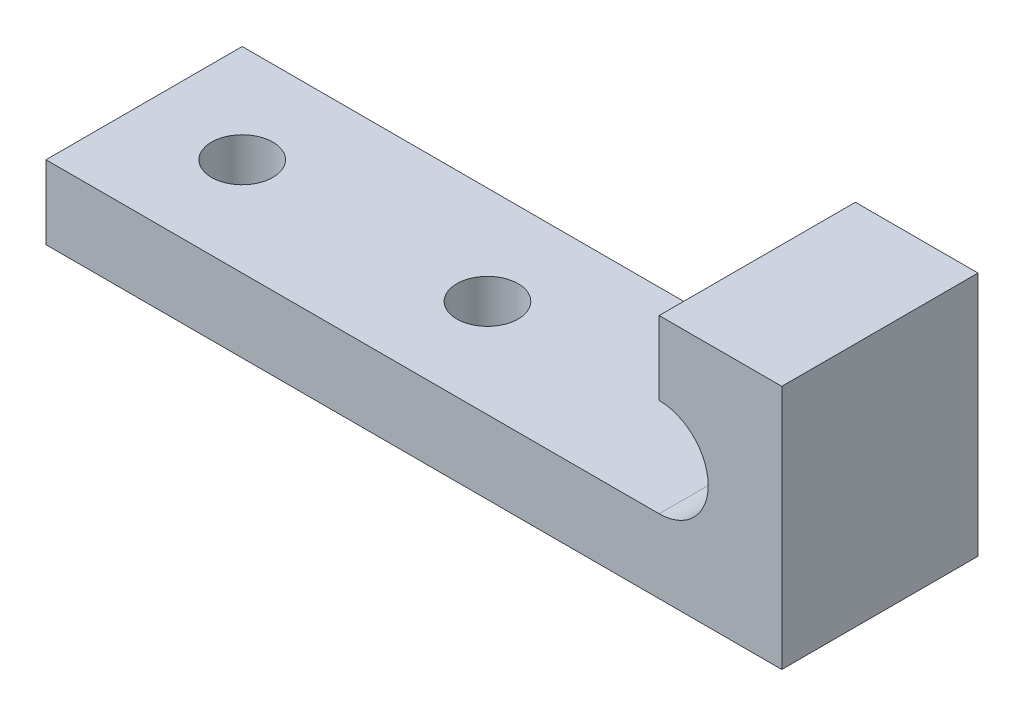
ISO-10303-21;
HEADER;
FILE_DESCRIPTION(('STEP AP214'),'2;1');
FILE_NAME('part.step','',(''),(''),'','','');
FILE_SCHEMA(('AUTOMOTIVE_DESIGN { 1 0 10303 214 1 1 1 1 }'));
ENDSEC;
DATA;
#1=APPLICATION_CONTEXT('core data for automotive mechanical design processes');
#2=APPLICATION_PROTOCOL_DEFINITION('international standard','automotive_design',2000,#1);
#3=PRODUCT_CONTEXT('',#1,'mechanical');
#4=PRODUCT('Part','Part','',(#3));
#5=PRODUCT_RELATED_PRODUCT_CATEGORY('part','',(#4));
#6=PRODUCT_DEFINITION_FORMATION('','',#4);
#7=PRODUCT_DEFINITION_CONTEXT('part definition',#1,'design');
#8=PRODUCT_DEFINITION('design','',#6,#7);
#9=PRODUCT_DEFINITION_SHAPE('','',#8);
#10=(LENGTH_UNIT() NAMED_UNIT(*) SI_UNIT(.MILLI.,.METRE.));
#11=(NAMED_UNIT(*) PLANE_ANGLE_UNIT() SI_UNIT($,.RADIAN.));
#12=(NAMED_UNIT(*) SI_UNIT($,.STERADIAN.) SOLID_ANGLE_UNIT());
#13=UNCERTAINTY_MEASURE_WITH_UNIT(LENGTH_MEASURE(1.E-05),#10,'distance_accuracy_value','');
#14=(GEOMETRIC_REPRESENTATION_CONTEXT(3) GLOBAL_UNCERTAINTY_ASSIGNED_CONTEXT((#13)) GLOBAL_UNIT_ASSIGNED_CONTEXT((#10,
#11,#12)) REPRESENTATION_CONTEXT('',''));
#15=CARTESIAN_POINT('',(0.,0.,0.));
#16=DIRECTION('',(0.,0.,1.));
#17=DIRECTION('',(1.,0.,0.));
#18=AXIS2_PLACEMENT_3D('',#15,#16,#17);
#19=CARTESIAN_POINT('',(-48.4006781787574,23.460872298257,8.));
#20=DIRECTION('',(0.,1.,0.));
#21=DIRECTION('',(0.,0.,1.));
#22=AXIS2_PLACEMENT_3D('',#19,#20,#21);
#23=PLANE('',#22);
#24=CARTESIAN_POINT('',(-64.4006781787574,23.460872298257,4.));
#25=DIRECTION('',(0.,1.,0.));
#26=DIRECTION('',(0.,0.,1.));
#27=AXIS2_PLACEMENT_3D('',#24,#25,#26);
#28=CIRCLE('',#27,1.25);
#29=CARTESIAN_POINT('',(-64.4006781787574,23.460872298257,5.25));
#30=VERTEX_POINT('',#29);
#31=EDGE_CURVE('E134',#30,#30,#28,.T.);
#32=ORIENTED_EDGE('',*,*,#31,.T.);
#33=EDGE_LOOP('',(#32));
#34=FACE_BOUND('',#33,.T.);
#35=CARTESIAN_POINT('',(-74.4006781787574,23.460872298257,4.));
#36=DIRECTION('',(0.,1.,0.));
#37=DIRECTION('',(0.,0.,1.));
#38=AXIS2_PLACEMENT_3D('',#35,#36,#37);
#39=CIRCLE('',#38,1.25);
#40=CARTESIAN_POINT('',(-74.4006781787574,23.460872298257,5.25));
#41=VERTEX_POINT('',#40);
#42=EDGE_CURVE('E126',#41,#41,#39,.T.);
#43=ORIENTED_EDGE('',*,*,#42,.T.);
#44=EDGE_LOOP('',(#43));
#45=FACE_BOUND('',#44,.T.);
#46=DIRECTION('',(1.,0.,0.));
#47=VECTOR('',#46,1.);
#48=CARTESIAN_POINT('',(-48.4006781787574,23.460872298257,0.));
#49=LINE('',#48,#47);
#50=CARTESIAN_POINT('',(-78.4006781787574,23.460872298257,0.));
#51=VERTEX_POINT('',#50);
#52=CARTESIAN_POINT('',(-48.4006781787574,23.460872298257,0.));
#53=VERTEX_POINT('',#52);
#54=EDGE_CURVE('E77',#51,#53,#49,.T.);
#55=ORIENTED_EDGE('',*,*,#54,.T.);
#56=DIRECTION('',(0.,0.,-1.));
#57=VECTOR('',#56,1.);
#58=CARTESIAN_POINT('',(-48.4006781787574,23.460872298257,8.));
#59=LINE('',#58,#57);
#60=CARTESIAN_POINT('',(-48.4006781787574,23.460872298257,8.));
#61=VERTEX_POINT('',#60);
#62=EDGE_CURVE('E11',#61,#53,#59,.T.);
#63=ORIENTED_EDGE('',*,*,#62,.F.);
#64=DIRECTION('',(1.,0.,0.));
#65=VECTOR('',#64,1.);
#66=CARTESIAN_POINT('',(-48.4006781787574,23.460872298257,8.));
#67=LINE('',#66,#65);
#68=CARTESIAN_POINT('',(-78.4006781787574,23.460872298257,8.));
#69=VERTEX_POINT('',#68);
#70=EDGE_CURVE('E88',#69,#61,#67,.T.);
#71=ORIENTED_EDGE('',*,*,#70,.F.);
#72=DIRECTION('',(0.,0.,1.));
#73=VECTOR('',#72,1.);
#74=CARTESIAN_POINT('',(-78.4006781787574,23.460872298257,0.));
#75=LINE('',#74,#73);
#76=EDGE_CURVE('E112',#51,#69,#75,.T.);
#77=ORIENTED_EDGE('',*,*,#76,.F.);
#78=EDGE_LOOP('',(#55,#63,#71,#77));
#79=FACE_BOUND('',#78,.T.);
#80=ADVANCED_FACE('F33',(#34,#45,#79),#23,.F.);
#81=CARTESIAN_POINT('',(-48.4006781787574,33.460872298257,8.));
#82=DIRECTION('',(-1.,0.,0.));
#83=DIRECTION('',(0.,0.,1.));
#84=AXIS2_PLACEMENT_3D('',#81,#82,#83);
#85=PLANE('',#84);
#86=DIRECTION('',(0.,1.,0.));
#87=VECTOR('',#86,1.);
#88=CARTESIAN_POINT('',(-48.4006781787574,33.460872298257,0.));
#89=LINE('',#88,#87);
#90=CARTESIAN_POINT('',(-48.4006781787574,33.460872298257,0.));
#91=VERTEX_POINT('',#90);
#92=EDGE_CURVE('E68',#53,#91,#89,.T.);
#93=ORIENTED_EDGE('',*,*,#92,.T.);
#94=DIRECTION('',(0.,0.,-1.));
#95=VECTOR('',#94,1.);
#96=CARTESIAN_POINT('',(-48.4006781787574,33.460872298257,8.));
#97=LINE('',#96,#95);
#98=CARTESIAN_POINT('',(-48.4006781787574,33.460872298257,8.));
#99=VERTEX_POINT('',#98);
#100=EDGE_CURVE('E40',#99,#91,#97,.T.);
#101=ORIENTED_EDGE('',*,*,#100,.F.);
#102=DIRECTION('',(0.,1.,0.));
#103=VECTOR('',#102,1.);
#104=CARTESIAN_POINT('',(-48.4006781787574,33.460872298257,8.));
#105=LINE('',#104,#103);
#106=EDGE_CURVE('E56',#61,#99,#105,.T.);
#107=ORIENTED_EDGE('',*,*,#106,.F.);
#108=ORIENTED_EDGE('',*,*,#62,.T.);
#109=EDGE_LOOP('',(#93,#101,#107,#108));
#110=FACE_BOUND('',#109,.T.);
#111=ADVANCED_FACE('F70',(#110),#85,.F.);
#112=CARTESIAN_POINT('',(-68.4006781787574,33.460872298257,8.));
#113=DIRECTION('',(0.,-1.,0.));
#114=DIRECTION('',(0.,0.,-1.));
#115=AXIS2_PLACEMENT_3D('',#112,#113,#114);
#116=PLANE('',#115);
#117=DIRECTION('',(-1.,0.,0.));
#118=VECTOR('',#117,1.);
#119=CARTESIAN_POINT('',(-68.4006781787574,33.460872298257,0.));
#120=LINE('',#119,#118);
#121=CARTESIAN_POINT('',(-53.4006781787574,33.460872298257,0.));
#122=VERTEX_POINT('',#121);
#123=EDGE_CURVE('E76',#91,#122,#120,.T.);
#124=ORIENTED_EDGE('',*,*,#123,.T.);
#125=DIRECTION('',(0.,0.,1.));
#126=VECTOR('',#125,1.);
#127=CARTESIAN_POINT('',(-53.4006781787574,33.460872298257,0.));
#128=LINE('',#127,#126);
#129=CARTESIAN_POINT('',(-53.4006781787574,33.460872298257,8.));
#130=VERTEX_POINT('',#129);
#131=EDGE_CURVE('E93',#122,#130,#128,.T.);
#132=ORIENTED_EDGE('',*,*,#131,.T.);
#133=DIRECTION('',(-1.,0.,0.));
#134=VECTOR('',#133,1.);
#135=CARTESIAN_POINT('',(-68.4006781787574,33.460872298257,8.));
#136=LINE('',#135,#134);
#137=EDGE_CURVE('E83',#99,#130,#136,.T.);
#138=ORIENTED_EDGE('',*,*,#137,.F.);
#139=ORIENTED_EDGE('',*,*,#100,.T.);
#140=EDGE_LOOP('',(#124,#132,#138,#139));
#141=FACE_BOUND('',#140,.T.);
#142=ADVANCED_FACE('F81',(#141),#116,.F.);
#143=CARTESIAN_POINT('',(0.,0.,8.));
#144=DIRECTION('',(0.,0.,-1.));
#145=DIRECTION('',(-1.,0.,0.));
#146=AXIS2_PLACEMENT_3D('',#143,#144,#145);
#147=PLANE('',#146);
#148=ORIENTED_EDGE('',*,*,#137,.T.);
#149=DIRECTION('',(0.,1.,0.));
#150=VECTOR('',#149,1.);
#151=CARTESIAN_POINT('',(-53.4006781787574,33.460872298257,8.));
#152=LINE('',#151,#150);
#153=CARTESIAN_POINT('',(-53.4006781787574,30.460872298257,8.));
#154=VERTEX_POINT('',#153);
#155=EDGE_CURVE('E102',#154,#130,#152,.T.);
#156=ORIENTED_EDGE('',*,*,#155,.F.);
#157=CARTESIAN_POINT('',(-53.4006781787574,28.460872298257,8.));
#158=DIRECTION('',(0.,0.,1.));
#159=DIRECTION('',(1.,0.,0.));
#160=AXIS2_PLACEMENT_3D('',#157,#158,#159);
#161=CIRCLE('',#160,2.00000000000001);
#162=CARTESIAN_POINT('',(-53.4006781787574,26.460872298257,8.));
#163=VERTEX_POINT('',#162);
#164=EDGE_CURVE('E106',#163,#154,#161,.T.);
#165=ORIENTED_EDGE('',*,*,#164,.F.);
#166=DIRECTION('',(1.,0.,0.));
#167=VECTOR('',#166,1.);
#168=CARTESIAN_POINT('',(-53.4006781787574,26.460872298257,8.));
#169=LINE('',#168,#167);
#170=CARTESIAN_POINT('',(-78.4006781787574,26.460872298257,8.));
#171=VERTEX_POINT('',#170);
#172=EDGE_CURVE('E109',#171,#163,#169,.T.);
#173=ORIENTED_EDGE('',*,*,#172,.F.);
#174=DIRECTION('',(0.,-1.,0.));
#175=VECTOR('',#174,1.);
#176=CARTESIAN_POINT('',(-78.4006781787574,26.460872298257,8.));
#177=LINE('',#176,#175);
#178=EDGE_CURVE('E123',#171,#69,#177,.T.);
#179=ORIENTED_EDGE('',*,*,#178,.T.);
#180=ORIENTED_EDGE('',*,*,#70,.T.);
#181=ORIENTED_EDGE('',*,*,#106,.T.);
#182=EDGE_LOOP('',(#148,#156,#165,#173,#179,#180,#181));
#183=FACE_BOUND('',#182,.T.);
#184=ADVANCED_FACE('F163',(#183),#147,.F.);
#185=CARTESIAN_POINT('',(0.,0.,0.));
#186=DIRECTION('',(0.,0.,-1.));
#187=DIRECTION('',(-1.,0.,0.));
#188=AXIS2_PLACEMENT_3D('',#185,#186,#187);
#189=PLANE('',#188);
#190=DIRECTION('',(0.,1.,0.));
#191=VECTOR('',#190,1.);
#192=CARTESIAN_POINT('',(-53.4006781787574,33.460872298257,0.));
#193=LINE('',#192,#191);
#194=CARTESIAN_POINT('',(-53.4006781787574,30.460872298257,0.));
#195=VERTEX_POINT('',#194);
#196=EDGE_CURVE('E87',#195,#122,#193,.T.);
#197=ORIENTED_EDGE('',*,*,#196,.T.);
#198=ORIENTED_EDGE('',*,*,#123,.F.);
#199=ORIENTED_EDGE('',*,*,#92,.F.);
#200=ORIENTED_EDGE('',*,*,#54,.F.);
#201=DIRECTION('',(0.,-1.,0.));
#202=VECTOR('',#201,1.);
#203=CARTESIAN_POINT('',(-78.4006781787574,26.460872298257,0.));
#204=LINE('',#203,#202);
#205=CARTESIAN_POINT('',(-78.4006781787574,26.460872298257,0.));
#206=VERTEX_POINT('',#205);
#207=EDGE_CURVE('E120',#206,#51,#204,.T.);
#208=ORIENTED_EDGE('',*,*,#207,.F.);
#209=DIRECTION('',(1.,0.,0.));
#210=VECTOR('',#209,1.);
#211=CARTESIAN_POINT('',(-53.4006781787574,26.460872298257,0.));
#212=LINE('',#211,#210);
#213=CARTESIAN_POINT('',(-53.4006781787574,26.460872298257,0.));
#214=VERTEX_POINT('',#213);
#215=EDGE_CURVE('E105',#206,#214,#212,.T.);
#216=ORIENTED_EDGE('',*,*,#215,.T.);
#217=CARTESIAN_POINT('',(-53.4006781787574,28.460872298257,0.));
#218=DIRECTION('',(0.,0.,1.));
#219=DIRECTION('',(1.,0.,0.));
#220=AXIS2_PLACEMENT_3D('',#217,#218,#219);
#221=CIRCLE('',#220,2.00000000000001);
#222=EDGE_CURVE('E47',#214,#195,#221,.T.);
#223=ORIENTED_EDGE('',*,*,#222,.T.);
#224=EDGE_LOOP('',(#197,#198,#199,#200,#208,#216,#223));
#225=FACE_BOUND('',#224,.T.);
#226=ADVANCED_FACE('F85',(#225),#189,.T.);
#227=CARTESIAN_POINT('',(-53.4006781787574,33.460872298257,0.));
#228=DIRECTION('',(1.,0.,0.));
#229=DIRECTION('',(0.,0.,-1.));
#230=AXIS2_PLACEMENT_3D('',#227,#228,#229);
#231=PLANE('',#230);
#232=ORIENTED_EDGE('',*,*,#155,.T.);
#233=ORIENTED_EDGE('',*,*,#131,.F.);
#234=ORIENTED_EDGE('',*,*,#196,.F.);
#235=DIRECTION('',(0.,0.,1.));
#236=VECTOR('',#235,1.);
#237=CARTESIAN_POINT('',(-53.4006781787574,30.460872298257,0.));
#238=LINE('',#237,#236);
#239=EDGE_CURVE('E98',#195,#154,#238,.T.);
#240=ORIENTED_EDGE('',*,*,#239,.T.);
#241=EDGE_LOOP('',(#232,#233,#234,#240));
#242=FACE_BOUND('',#241,.T.);
#243=ADVANCED_FACE('F202',(#242),#231,.F.);
#244=CARTESIAN_POINT('',(-53.4006781787574,28.460872298257,0.));
#245=DIRECTION('',(0.,0.,1.));
#246=DIRECTION('',(1.,0.,0.));
#247=AXIS2_PLACEMENT_3D('',#244,#245,#246);
#248=CYLINDRICAL_SURFACE('',#247,2.00000000000001);
#249=ORIENTED_EDGE('',*,*,#164,.T.);
#250=ORIENTED_EDGE('',*,*,#239,.F.);
#251=ORIENTED_EDGE('',*,*,#222,.F.);
#252=DIRECTION('',(0.,0.,1.));
#253=VECTOR('',#252,1.);
#254=CARTESIAN_POINT('',(-53.4006781787574,26.460872298257,0.));
#255=LINE('',#254,#253);
#256=EDGE_CURVE('E96',#214,#163,#255,.T.);
#257=ORIENTED_EDGE('',*,*,#256,.T.);
#258=EDGE_LOOP('',(#249,#250,#251,#257));
#259=FACE_BOUND('',#258,.T.);
#260=ADVANCED_FACE('F148',(#259),#248,.F.);
#261=CARTESIAN_POINT('',(-53.4006781787574,26.460872298257,0.));
#262=DIRECTION('',(0.,-1.,0.));
#263=DIRECTION('',(0.,0.,-1.));
#264=AXIS2_PLACEMENT_3D('',#261,#262,#263);
#265=PLANE('',#264);
#266=CARTESIAN_POINT('',(-64.4006781787574,26.460872298257,4.));
#267=DIRECTION('',(0.,1.,0.));
#268=DIRECTION('',(0.,0.,1.));
#269=AXIS2_PLACEMENT_3D('',#266,#267,#268);
#270=CIRCLE('',#269,1.25);
#271=CARTESIAN_POINT('',(-64.4006781787574,26.460872298257,5.25));
#272=VERTEX_POINT('',#271);
#273=EDGE_CURVE('E137',#272,#272,#270,.T.);
#274=ORIENTED_EDGE('',*,*,#273,.F.);
#275=EDGE_LOOP('',(#274));
#276=FACE_BOUND('',#275,.T.);
#277=CARTESIAN_POINT('',(-74.4006781787574,26.460872298257,4.));
#278=DIRECTION('',(0.,1.,0.));
#279=DIRECTION('',(0.,0.,1.));
#280=AXIS2_PLACEMENT_3D('',#277,#278,#279);
#281=CIRCLE('',#280,1.25);
#282=CARTESIAN_POINT('',(-74.4006781787574,26.460872298257,5.25));
#283=VERTEX_POINT('',#282);
#284=EDGE_CURVE('E131',#283,#283,#281,.T.);
#285=ORIENTED_EDGE('',*,*,#284,.F.);
#286=EDGE_LOOP('',(#285));
#287=FACE_BOUND('',#286,.T.);
#288=ORIENTED_EDGE('',*,*,#172,.T.);
#289=ORIENTED_EDGE('',*,*,#256,.F.);
#290=ORIENTED_EDGE('',*,*,#215,.F.);
#291=DIRECTION('',(0.,0.,1.));
#292=VECTOR('',#291,1.);
#293=CARTESIAN_POINT('',(-78.4006781787574,26.460872298257,0.));
#294=LINE('',#293,#292);
#295=EDGE_CURVE('E117',#206,#171,#294,.T.);
#296=ORIENTED_EDGE('',*,*,#295,.T.);
#297=EDGE_LOOP('',(#288,#289,#290,#296));
#298=FACE_BOUND('',#297,.T.);
#299=ADVANCED_FACE('F144',(#276,#287,#298),#265,.F.);
#300=CARTESIAN_POINT('',(-78.4006781787574,26.460872298257,0.));
#301=DIRECTION('',(-1.,0.,0.));
#302=DIRECTION('',(0.,0.,1.));
#303=AXIS2_PLACEMENT_3D('',#300,#301,#302);
#304=PLANE('',#303);
#305=ORIENTED_EDGE('',*,*,#178,.F.);
#306=ORIENTED_EDGE('',*,*,#295,.F.);
#307=ORIENTED_EDGE('',*,*,#207,.T.);
#308=ORIENTED_EDGE('',*,*,#76,.T.);
#309=EDGE_LOOP('',(#305,#306,#307,#308));
#310=FACE_BOUND('',#309,.T.);
#311=ADVANCED_FACE('F147',(#310),#304,.T.);
#312=CARTESIAN_POINT('',(-74.4006781787574,18.460872298257,4.));
#313=DIRECTION('',(0.,1.,0.));
#314=DIRECTION('',(0.,0.,1.));
#315=AXIS2_PLACEMENT_3D('',#312,#313,#314);
#316=CYLINDRICAL_SURFACE('',#315,1.25);
#317=ORIENTED_EDGE('',*,*,#284,.T.);
#318=EDGE_LOOP('',(#317));
#319=FACE_BOUND('',#318,.T.);
#320=ORIENTED_EDGE('',*,*,#42,.F.);
#321=EDGE_LOOP('',(#320));
#322=FACE_BOUND('',#321,.T.);
#323=ADVANCED_FACE('F191',(#319,#322),#316,.F.);
#324=CARTESIAN_POINT('',(-64.4006781787574,18.460872298257,4.));
#325=DIRECTION('',(0.,1.,0.));
#326=DIRECTION('',(0.,0.,1.));
#327=AXIS2_PLACEMENT_3D('',#324,#325,#326);
#328=CYLINDRICAL_SURFACE('',#327,1.25);
#329=ORIENTED_EDGE('',*,*,#273,.T.);
#330=EDGE_LOOP('',(#329));
#331=FACE_BOUND('',#330,.T.);
#332=ORIENTED_EDGE('',*,*,#31,.F.);
#333=EDGE_LOOP('',(#332));
#334=FACE_BOUND('',#333,.T.);
#335=ADVANCED_FACE('F141',(#331,#334),#328,.F.);
#336=CLOSED_SHELL('',(#80,#111,#142,#184,#226,#243,#260,#299,#311,#323,#335));
#337=MANIFOLD_SOLID_BREP('B2',#336);
#338=ADVANCED_BREP_SHAPE_REPRESENTATION('',(#18,#337),#14);
#339=SHAPE_DEFINITION_REPRESENTATION(#9,#338);
ENDSEC;
END-ISO-10303-21;
